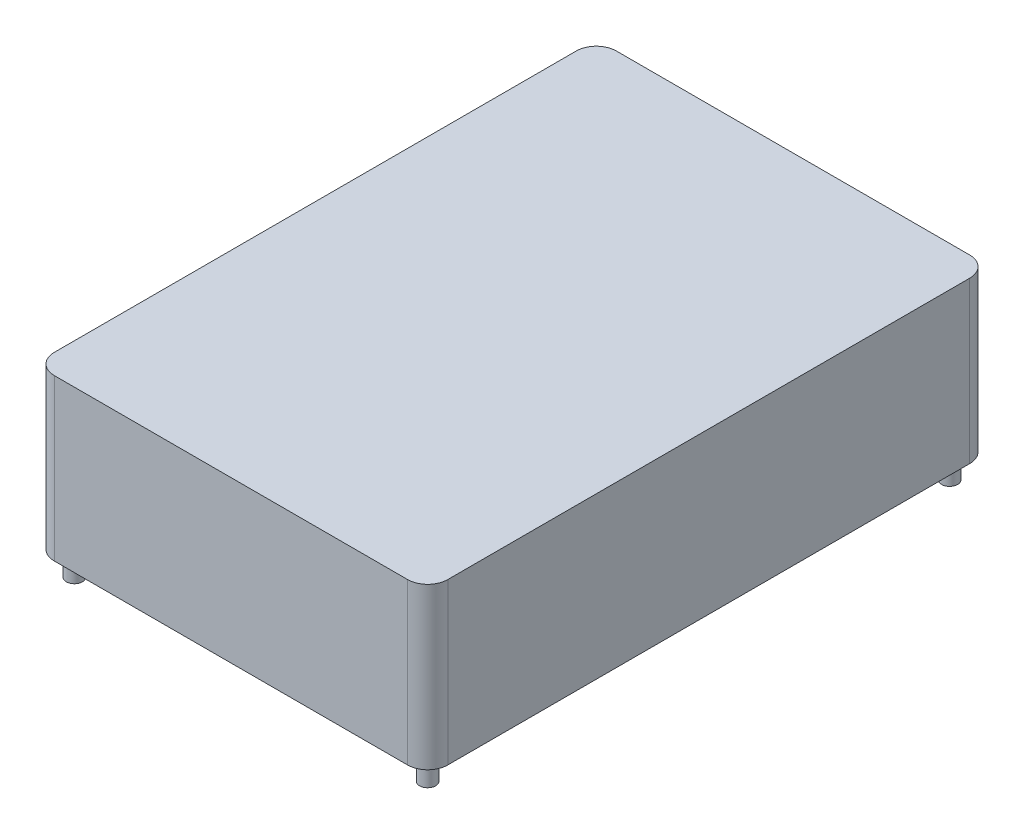
ISO-10303-21;
HEADER;
FILE_DESCRIPTION(('STEP AP214'),'2;1');
FILE_NAME('part.step','',(''),(''),'','','');
FILE_SCHEMA(('AUTOMOTIVE_DESIGN { 1 0 10303 214 1 1 1 1 }'));
ENDSEC;
DATA;
#1=APPLICATION_CONTEXT('core data for automotive mechanical design processes');
#2=APPLICATION_PROTOCOL_DEFINITION('international standard','automotive_design',2000,#1);
#3=PRODUCT_CONTEXT('',#1,'mechanical');
#4=PRODUCT('Part','Part','',(#3));
#5=PRODUCT_RELATED_PRODUCT_CATEGORY('part','',(#4));
#6=PRODUCT_DEFINITION_FORMATION('','',#4);
#7=PRODUCT_DEFINITION_CONTEXT('part definition',#1,'design');
#8=PRODUCT_DEFINITION('design','',#6,#7);
#9=PRODUCT_DEFINITION_SHAPE('','',#8);
#10=(LENGTH_UNIT() NAMED_UNIT(*) SI_UNIT(.MILLI.,.METRE.));
#11=(NAMED_UNIT(*) PLANE_ANGLE_UNIT() SI_UNIT($,.RADIAN.));
#12=(NAMED_UNIT(*) SI_UNIT($,.STERADIAN.) SOLID_ANGLE_UNIT());
#13=UNCERTAINTY_MEASURE_WITH_UNIT(LENGTH_MEASURE(1.E-05),#10,'distance_accuracy_value','');
#14=(GEOMETRIC_REPRESENTATION_CONTEXT(3) GLOBAL_UNCERTAINTY_ASSIGNED_CONTEXT((#13)) GLOBAL_UNIT_ASSIGNED_CONTEXT((#10,
#11,#12)) REPRESENTATION_CONTEXT('',''));
#15=CARTESIAN_POINT('',(0.,0.,0.));
#16=DIRECTION('',(0.,0.,1.));
#17=DIRECTION('',(1.,0.,0.));
#18=AXIS2_PLACEMENT_3D('',#15,#16,#17);
#19=CARTESIAN_POINT('',(62.23,50.8,88.9));
#20=DIRECTION('',(-1.,0.,0.));
#21=DIRECTION('',(0.,0.,1.));
#22=AXIS2_PLACEMENT_3D('',#19,#20,#21);
#23=PLANE('',#22);
#24=DIRECTION('',(0.,0.,-1.));
#25=VECTOR('',#24,1.);
#26=CARTESIAN_POINT('',(62.23,0.,88.9));
#27=LINE('',#26,#25);
#28=CARTESIAN_POINT('',(62.23,0.,82.55));
#29=VERTEX_POINT('',#28);
#30=CARTESIAN_POINT('',(62.23,0.,-82.55));
#31=VERTEX_POINT('',#30);
#32=EDGE_CURVE('E136',#29,#31,#27,.T.);
#33=ORIENTED_EDGE('',*,*,#32,.T.);
#34=DIRECTION('',(0.,-1.,0.));
#35=VECTOR('',#34,1.);
#36=CARTESIAN_POINT('',(62.23,50.8,-82.55));
#37=LINE('',#36,#35);
#38=CARTESIAN_POINT('',(62.23,50.8,-82.55));
#39=VERTEX_POINT('',#38);
#40=EDGE_CURVE('E111',#31,#39,#37,.F.);
#41=ORIENTED_EDGE('',*,*,#40,.T.);
#42=DIRECTION('',(0.,0.,-1.));
#43=VECTOR('',#42,1.);
#44=CARTESIAN_POINT('',(62.23,50.8,88.9));
#45=LINE('',#44,#43);
#46=CARTESIAN_POINT('',(62.23,50.8,82.55));
#47=VERTEX_POINT('',#46);
#48=EDGE_CURVE('E150',#47,#39,#45,.T.);
#49=ORIENTED_EDGE('',*,*,#48,.F.);
#50=DIRECTION('',(0.,-1.,0.));
#51=VECTOR('',#50,1.);
#52=CARTESIAN_POINT('',(62.23,50.8,82.55));
#53=LINE('',#52,#51);
#54=EDGE_CURVE('E117',#47,#29,#53,.T.);
#55=ORIENTED_EDGE('',*,*,#54,.T.);
#56=EDGE_LOOP('',(#33,#41,#49,#55));
#57=FACE_BOUND('',#56,.T.);
#58=ADVANCED_FACE('F38',(#57),#23,.F.);
#59=CARTESIAN_POINT('',(-62.23,50.8,-88.9));
#60=DIRECTION('',(0.,0.,1.));
#61=DIRECTION('',(1.,0.,0.));
#62=AXIS2_PLACEMENT_3D('',#59,#60,#61);
#63=PLANE('',#62);
#64=DIRECTION('',(-1.,0.,0.));
#65=VECTOR('',#64,1.);
#66=CARTESIAN_POINT('',(-62.23,50.8,-88.9));
#67=LINE('',#66,#65);
#68=CARTESIAN_POINT('',(55.88,50.8,-88.9));
#69=VERTEX_POINT('',#68);
#70=CARTESIAN_POINT('',(-55.88,50.8,-88.9));
#71=VERTEX_POINT('',#70);
#72=EDGE_CURVE('E127',#69,#71,#67,.T.);
#73=ORIENTED_EDGE('',*,*,#72,.F.);
#74=DIRECTION('',(0.,-1.,0.));
#75=VECTOR('',#74,1.);
#76=CARTESIAN_POINT('',(55.88,50.8,-88.9));
#77=LINE('',#76,#75);
#78=CARTESIAN_POINT('',(55.88,0.,-88.9));
#79=VERTEX_POINT('',#78);
#80=EDGE_CURVE('E110',#69,#79,#77,.T.);
#81=ORIENTED_EDGE('',*,*,#80,.T.);
#82=DIRECTION('',(-1.,0.,0.));
#83=VECTOR('',#82,1.);
#84=CARTESIAN_POINT('',(-62.23,0.,-88.9));
#85=LINE('',#84,#83);
#86=CARTESIAN_POINT('',(-55.88,0.,-88.9));
#87=VERTEX_POINT('',#86);
#88=EDGE_CURVE('E124',#79,#87,#85,.T.);
#89=ORIENTED_EDGE('',*,*,#88,.T.);
#90=DIRECTION('',(0.,-1.,0.));
#91=VECTOR('',#90,1.);
#92=CARTESIAN_POINT('',(-55.88,50.8,-88.9));
#93=LINE('',#92,#91);
#94=EDGE_CURVE('E130',#87,#71,#93,.F.);
#95=ORIENTED_EDGE('',*,*,#94,.T.);
#96=EDGE_LOOP('',(#73,#81,#89,#95));
#97=FACE_BOUND('',#96,.T.);
#98=ADVANCED_FACE('F123',(#97),#63,.F.);
#99=CARTESIAN_POINT('',(-62.23,50.8,88.9));
#100=DIRECTION('',(1.,0.,0.));
#101=DIRECTION('',(0.,0.,-1.));
#102=AXIS2_PLACEMENT_3D('',#99,#100,#101);
#103=PLANE('',#102);
#104=DIRECTION('',(0.,0.,1.));
#105=VECTOR('',#104,1.);
#106=CARTESIAN_POINT('',(-62.23,0.,88.9));
#107=LINE('',#106,#105);
#108=CARTESIAN_POINT('',(-62.23,0.,-82.55));
#109=VERTEX_POINT('',#108);
#110=CARTESIAN_POINT('',(-62.23,0.,82.55));
#111=VERTEX_POINT('',#110);
#112=EDGE_CURVE('E135',#109,#111,#107,.T.);
#113=ORIENTED_EDGE('',*,*,#112,.T.);
#114=DIRECTION('',(0.,-1.,0.));
#115=VECTOR('',#114,1.);
#116=CARTESIAN_POINT('',(-62.23,50.8,82.55));
#117=LINE('',#116,#115);
#118=CARTESIAN_POINT('',(-62.23,50.8,82.55));
#119=VERTEX_POINT('',#118);
#120=EDGE_CURVE('E187',#111,#119,#117,.F.);
#121=ORIENTED_EDGE('',*,*,#120,.T.);
#122=DIRECTION('',(0.,0.,1.));
#123=VECTOR('',#122,1.);
#124=CARTESIAN_POINT('',(-62.23,50.8,88.9));
#125=LINE('',#124,#123);
#126=CARTESIAN_POINT('',(-62.23,50.8,-82.55));
#127=VERTEX_POINT('',#126);
#128=EDGE_CURVE('E237',#127,#119,#125,.T.);
#129=ORIENTED_EDGE('',*,*,#128,.F.);
#130=DIRECTION('',(0.,-1.,0.));
#131=VECTOR('',#130,1.);
#132=CARTESIAN_POINT('',(-62.23,50.8,-82.55));
#133=LINE('',#132,#131);
#134=EDGE_CURVE('E183',#127,#109,#133,.T.);
#135=ORIENTED_EDGE('',*,*,#134,.T.);
#136=EDGE_LOOP('',(#113,#121,#129,#135));
#137=FACE_BOUND('',#136,.T.);
#138=ADVANCED_FACE('F254',(#137),#103,.F.);
#139=CARTESIAN_POINT('',(-62.23,50.8,88.9));
#140=DIRECTION('',(0.,0.,-1.));
#141=DIRECTION('',(-1.,0.,0.));
#142=AXIS2_PLACEMENT_3D('',#139,#140,#141);
#143=PLANE('',#142);
#144=DIRECTION('',(1.,0.,0.));
#145=VECTOR('',#144,1.);
#146=CARTESIAN_POINT('',(-62.23,0.,88.9));
#147=LINE('',#146,#145);
#148=CARTESIAN_POINT('',(-55.88,0.,88.9));
#149=VERTEX_POINT('',#148);
#150=CARTESIAN_POINT('',(55.88,0.,88.9));
#151=VERTEX_POINT('',#150);
#152=EDGE_CURVE('E142',#149,#151,#147,.T.);
#153=ORIENTED_EDGE('',*,*,#152,.T.);
#154=DIRECTION('',(0.,-1.,0.));
#155=VECTOR('',#154,1.);
#156=CARTESIAN_POINT('',(55.88,50.8,88.9));
#157=LINE('',#156,#155);
#158=CARTESIAN_POINT('',(55.88,50.8,88.9));
#159=VERTEX_POINT('',#158);
#160=EDGE_CURVE('E54',#151,#159,#157,.F.);
#161=ORIENTED_EDGE('',*,*,#160,.T.);
#162=DIRECTION('',(1.,0.,0.));
#163=VECTOR('',#162,1.);
#164=CARTESIAN_POINT('',(-62.23,50.8,88.9));
#165=LINE('',#164,#163);
#166=CARTESIAN_POINT('',(-55.88,50.8,88.9));
#167=VERTEX_POINT('',#166);
#168=EDGE_CURVE('E152',#167,#159,#165,.T.);
#169=ORIENTED_EDGE('',*,*,#168,.F.);
#170=DIRECTION('',(0.,-1.,0.));
#171=VECTOR('',#170,1.);
#172=CARTESIAN_POINT('',(-55.88,50.8,88.9));
#173=LINE('',#172,#171);
#174=EDGE_CURVE('E177',#167,#149,#173,.T.);
#175=ORIENTED_EDGE('',*,*,#174,.T.);
#176=EDGE_LOOP('',(#153,#161,#169,#175));
#177=FACE_BOUND('',#176,.T.);
#178=ADVANCED_FACE('F249',(#177),#143,.F.);
#179=CARTESIAN_POINT('',(0.,50.8,0.));
#180=DIRECTION('',(0.,-1.,0.));
#181=DIRECTION('',(0.,0.,-1.));
#182=AXIS2_PLACEMENT_3D('',#179,#180,#181);
#183=PLANE('',#182);
#184=ORIENTED_EDGE('',*,*,#48,.T.);
#185=CARTESIAN_POINT('',(55.88,50.8,-82.55));
#186=DIRECTION('',(0.,-1.,0.));
#187=DIRECTION('',(0.,0.,-1.));
#188=AXIS2_PLACEMENT_3D('',#185,#186,#187);
#189=CIRCLE('',#188,6.35);
#190=EDGE_CURVE('E174',#39,#69,#189,.F.);
#191=ORIENTED_EDGE('',*,*,#190,.T.);
#192=ORIENTED_EDGE('',*,*,#72,.T.);
#193=CARTESIAN_POINT('',(-55.88,50.8,-82.55));
#194=DIRECTION('',(0.,-1.,0.));
#195=DIRECTION('',(0.,0.,-1.));
#196=AXIS2_PLACEMENT_3D('',#193,#194,#195);
#197=CIRCLE('',#196,6.35);
#198=EDGE_CURVE('E166',#71,#127,#197,.F.);
#199=ORIENTED_EDGE('',*,*,#198,.T.);
#200=ORIENTED_EDGE('',*,*,#128,.T.);
#201=CARTESIAN_POINT('',(-55.88,50.8,82.55));
#202=DIRECTION('',(0.,-1.,0.));
#203=DIRECTION('',(0.,0.,-1.));
#204=AXIS2_PLACEMENT_3D('',#201,#202,#203);
#205=CIRCLE('',#204,6.35);
#206=EDGE_CURVE('E61',#119,#167,#205,.F.);
#207=ORIENTED_EDGE('',*,*,#206,.T.);
#208=ORIENTED_EDGE('',*,*,#168,.T.);
#209=CARTESIAN_POINT('',(55.88,50.8,82.55));
#210=DIRECTION('',(0.,-1.,0.));
#211=DIRECTION('',(0.,0.,-1.));
#212=AXIS2_PLACEMENT_3D('',#209,#210,#211);
#213=CIRCLE('',#212,6.35);
#214=EDGE_CURVE('E171',#159,#47,#213,.F.);
#215=ORIENTED_EDGE('',*,*,#214,.T.);
#216=EDGE_LOOP('',(#184,#191,#192,#199,#200,#207,#208,#215));
#217=FACE_BOUND('',#216,.T.);
#218=ADVANCED_FACE('F207',(#217),#183,.F.);
#219=CARTESIAN_POINT('',(0.,0.,0.));
#220=DIRECTION('',(0.,-1.,0.));
#221=DIRECTION('',(0.,0.,-1.));
#222=AXIS2_PLACEMENT_3D('',#219,#220,#221);
#223=PLANE('',#222);
#224=CARTESIAN_POINT('',(55.88,0.,82.55));
#225=DIRECTION('',(0.,-1.,0.));
#226=DIRECTION('',(0.,0.,-1.));
#227=AXIS2_PLACEMENT_3D('',#224,#225,#226);
#228=CIRCLE('',#227,2.54);
#229=CARTESIAN_POINT('',(55.88,0.,85.09));
#230=VERTEX_POINT('',#229);
#231=EDGE_CURVE('E11',#230,#230,#228,.T.);
#232=ORIENTED_EDGE('',*,*,#231,.F.);
#233=EDGE_LOOP('',(#232));
#234=FACE_BOUND('',#233,.T.);
#235=CARTESIAN_POINT('',(-55.88,0.,82.55));
#236=DIRECTION('',(0.,-1.,0.));
#237=DIRECTION('',(0.,0.,-1.));
#238=AXIS2_PLACEMENT_3D('',#235,#236,#237);
#239=CIRCLE('',#238,2.54);
#240=CARTESIAN_POINT('',(-55.88,0.,85.09));
#241=VERTEX_POINT('',#240);
#242=EDGE_CURVE('E47',#241,#241,#239,.T.);
#243=ORIENTED_EDGE('',*,*,#242,.F.);
#244=EDGE_LOOP('',(#243));
#245=FACE_BOUND('',#244,.T.);
#246=CARTESIAN_POINT('',(55.88,0.,-82.55));
#247=DIRECTION('',(0.,-1.,0.));
#248=DIRECTION('',(0.,0.,-1.));
#249=AXIS2_PLACEMENT_3D('',#246,#247,#248);
#250=CIRCLE('',#249,2.54);
#251=CARTESIAN_POINT('',(55.88,0.,-80.01));
#252=VERTEX_POINT('',#251);
#253=EDGE_CURVE('E194',#252,#252,#250,.T.);
#254=ORIENTED_EDGE('',*,*,#253,.F.);
#255=EDGE_LOOP('',(#254));
#256=FACE_BOUND('',#255,.T.);
#257=CARTESIAN_POINT('',(-55.88,0.,-82.55));
#258=DIRECTION('',(0.,-1.,0.));
#259=DIRECTION('',(0.,0.,-1.));
#260=AXIS2_PLACEMENT_3D('',#257,#258,#259);
#261=CIRCLE('',#260,2.54);
#262=CARTESIAN_POINT('',(-55.88,0.,-80.01));
#263=VERTEX_POINT('',#262);
#264=EDGE_CURVE('E190',#263,#263,#261,.T.);
#265=ORIENTED_EDGE('',*,*,#264,.F.);
#266=EDGE_LOOP('',(#265));
#267=FACE_BOUND('',#266,.T.);
#268=ORIENTED_EDGE('',*,*,#88,.F.);
#269=CARTESIAN_POINT('',(55.88,0.,-82.55));
#270=DIRECTION('',(0.,-1.,0.));
#271=DIRECTION('',(0.,0.,-1.));
#272=AXIS2_PLACEMENT_3D('',#269,#270,#271);
#273=CIRCLE('',#272,6.35);
#274=EDGE_CURVE('E106',#79,#31,#273,.T.);
#275=ORIENTED_EDGE('',*,*,#274,.T.);
#276=ORIENTED_EDGE('',*,*,#32,.F.);
#277=CARTESIAN_POINT('',(55.88,0.,82.55));
#278=DIRECTION('',(0.,-1.,0.));
#279=DIRECTION('',(0.,0.,-1.));
#280=AXIS2_PLACEMENT_3D('',#277,#278,#279);
#281=CIRCLE('',#280,6.35);
#282=EDGE_CURVE('E118',#29,#151,#281,.T.);
#283=ORIENTED_EDGE('',*,*,#282,.T.);
#284=ORIENTED_EDGE('',*,*,#152,.F.);
#285=CARTESIAN_POINT('',(-55.88,0.,82.55));
#286=DIRECTION('',(0.,-1.,0.));
#287=DIRECTION('',(0.,0.,-1.));
#288=AXIS2_PLACEMENT_3D('',#285,#286,#287);
#289=CIRCLE('',#288,6.35);
#290=EDGE_CURVE('E156',#149,#111,#289,.T.);
#291=ORIENTED_EDGE('',*,*,#290,.T.);
#292=ORIENTED_EDGE('',*,*,#112,.F.);
#293=CARTESIAN_POINT('',(-55.88,0.,-82.55));
#294=DIRECTION('',(0.,-1.,0.));
#295=DIRECTION('',(0.,0.,-1.));
#296=AXIS2_PLACEMENT_3D('',#293,#294,#295);
#297=CIRCLE('',#296,6.35);
#298=EDGE_CURVE('E129',#109,#87,#297,.T.);
#299=ORIENTED_EDGE('',*,*,#298,.T.);
#300=EDGE_LOOP('',(#268,#275,#276,#283,#284,#291,#292,#299));
#301=FACE_BOUND('',#300,.T.);
#302=ADVANCED_FACE('F132',(#234,#245,#256,#267,#301),#223,.T.);
#303=CARTESIAN_POINT('',(55.88,50.8,-82.55));
#304=DIRECTION('',(0.,-1.,0.));
#305=DIRECTION('',(0.,0.,-1.));
#306=AXIS2_PLACEMENT_3D('',#303,#304,#305);
#307=CYLINDRICAL_SURFACE('',#306,6.35);
#308=ORIENTED_EDGE('',*,*,#190,.F.);
#309=ORIENTED_EDGE('',*,*,#40,.F.);
#310=ORIENTED_EDGE('',*,*,#274,.F.);
#311=ORIENTED_EDGE('',*,*,#80,.F.);
#312=EDGE_LOOP('',(#308,#309,#310,#311));
#313=FACE_BOUND('',#312,.T.);
#314=ADVANCED_FACE('F109',(#313),#307,.T.);
#315=CARTESIAN_POINT('',(55.88,50.8,82.55));
#316=DIRECTION('',(0.,-1.,0.));
#317=DIRECTION('',(0.,0.,-1.));
#318=AXIS2_PLACEMENT_3D('',#315,#316,#317);
#319=CYLINDRICAL_SURFACE('',#318,6.35);
#320=ORIENTED_EDGE('',*,*,#214,.F.);
#321=ORIENTED_EDGE('',*,*,#160,.F.);
#322=ORIENTED_EDGE('',*,*,#282,.F.);
#323=ORIENTED_EDGE('',*,*,#54,.F.);
#324=EDGE_LOOP('',(#320,#321,#322,#323));
#325=FACE_BOUND('',#324,.T.);
#326=ADVANCED_FACE('F246',(#325),#319,.T.);
#327=CARTESIAN_POINT('',(-55.88,50.8,82.55));
#328=DIRECTION('',(0.,-1.,0.));
#329=DIRECTION('',(0.,0.,-1.));
#330=AXIS2_PLACEMENT_3D('',#327,#328,#329);
#331=CYLINDRICAL_SURFACE('',#330,6.35);
#332=ORIENTED_EDGE('',*,*,#206,.F.);
#333=ORIENTED_EDGE('',*,*,#120,.F.);
#334=ORIENTED_EDGE('',*,*,#290,.F.);
#335=ORIENTED_EDGE('',*,*,#174,.F.);
#336=EDGE_LOOP('',(#332,#333,#334,#335));
#337=FACE_BOUND('',#336,.T.);
#338=ADVANCED_FACE('F251',(#337),#331,.T.);
#339=CARTESIAN_POINT('',(-55.88,50.8,-82.55));
#340=DIRECTION('',(0.,-1.,0.));
#341=DIRECTION('',(0.,0.,-1.));
#342=AXIS2_PLACEMENT_3D('',#339,#340,#341);
#343=CYLINDRICAL_SURFACE('',#342,6.35);
#344=ORIENTED_EDGE('',*,*,#198,.F.);
#345=ORIENTED_EDGE('',*,*,#94,.F.);
#346=ORIENTED_EDGE('',*,*,#298,.F.);
#347=ORIENTED_EDGE('',*,*,#134,.F.);
#348=EDGE_LOOP('',(#344,#345,#346,#347));
#349=FACE_BOUND('',#348,.T.);
#350=ADVANCED_FACE('F40',(#349),#343,.T.);
#351=CARTESIAN_POINT('',(-55.88,-7.61999999999999,-82.55));
#352=DIRECTION('',(0.,1.,0.));
#353=DIRECTION('',(0.,0.,1.));
#354=AXIS2_PLACEMENT_3D('',#351,#352,#353);
#355=CYLINDRICAL_SURFACE('',#354,2.54);
#356=CARTESIAN_POINT('',(-55.88,-7.61999999999999,-82.55));
#357=DIRECTION('',(0.,1.,0.));
#358=DIRECTION('',(0.,0.,1.));
#359=AXIS2_PLACEMENT_3D('',#356,#357,#358);
#360=CIRCLE('',#359,2.54);
#361=CARTESIAN_POINT('',(-55.88,-7.62,-80.01));
#362=VERTEX_POINT('',#361);
#363=EDGE_CURVE('E144',#362,#362,#360,.T.);
#364=CARTESIAN_POINT('',(-55.88,0.,-80.01));
#365=CARTESIAN_POINT('',(-55.88,-0.0793749999999989,-80.01));
#366=CARTESIAN_POINT('',(-55.88,-0.158749999999999,-80.01));
#367=CARTESIAN_POINT('',(-55.88,-0.317499999999999,-80.01));
#368=CARTESIAN_POINT('',(-55.88,-0.396874999999999,-80.01));
#369=CARTESIAN_POINT('',(-55.88,-0.555624999999999,-80.01));
#370=CARTESIAN_POINT('',(-55.88,-0.634999999999999,-80.01));
#371=CARTESIAN_POINT('',(-55.88,-0.793749999999999,-80.01));
#372=CARTESIAN_POINT('',(-55.88,-0.873124999999999,-80.01));
#373=CARTESIAN_POINT('',(-55.88,-1.031875,-80.01));
#374=CARTESIAN_POINT('',(-55.88,-1.11125,-80.01));
#375=CARTESIAN_POINT('',(-55.88,-1.27,-80.01));
#376=CARTESIAN_POINT('',(-55.88,-1.349375,-80.01));
#377=CARTESIAN_POINT('',(-55.88,-1.508125,-80.01));
#378=CARTESIAN_POINT('',(-55.88,-1.5875,-80.01));
#379=CARTESIAN_POINT('',(-55.88,-1.74625,-80.01));
#380=CARTESIAN_POINT('',(-55.88,-1.825625,-80.01));
#381=CARTESIAN_POINT('',(-55.88,-1.984375,-80.01));
#382=CARTESIAN_POINT('',(-55.88,-2.06375,-80.01));
#383=CARTESIAN_POINT('',(-55.88,-2.2225,-80.01));
#384=CARTESIAN_POINT('',(-55.88,-2.301875,-80.01));
#385=CARTESIAN_POINT('',(-55.88,-2.460625,-80.01));
#386=CARTESIAN_POINT('',(-55.88,-2.54,-80.01));
#387=CARTESIAN_POINT('',(-55.88,-2.69875,-80.01));
#388=CARTESIAN_POINT('',(-55.88,-2.778125,-80.01));
#389=CARTESIAN_POINT('',(-55.88,-2.936875,-80.01));
#390=CARTESIAN_POINT('',(-55.88,-3.01625,-80.01));
#391=CARTESIAN_POINT('',(-55.88,-3.175,-80.01));
#392=CARTESIAN_POINT('',(-55.88,-3.254375,-80.01));
#393=CARTESIAN_POINT('',(-55.88,-3.413125,-80.01));
#394=CARTESIAN_POINT('',(-55.88,-3.4925,-80.01));
#395=CARTESIAN_POINT('',(-55.88,-3.65125,-80.01));
#396=CARTESIAN_POINT('',(-55.88,-3.730625,-80.01));
#397=CARTESIAN_POINT('',(-55.88,-3.889375,-80.01));
#398=CARTESIAN_POINT('',(-55.88,-3.96875,-80.01));
#399=CARTESIAN_POINT('',(-55.88,-4.1275,-80.01));
#400=CARTESIAN_POINT('',(-55.88,-4.206875,-80.01));
#401=CARTESIAN_POINT('',(-55.88,-4.365625,-80.01));
#402=CARTESIAN_POINT('',(-55.88,-4.445,-80.01));
#403=CARTESIAN_POINT('',(-55.88,-4.60375,-80.01));
#404=CARTESIAN_POINT('',(-55.88,-4.683125,-80.01));
#405=CARTESIAN_POINT('',(-55.88,-4.841875,-80.01));
#406=CARTESIAN_POINT('',(-55.88,-4.92125,-80.01));
#407=CARTESIAN_POINT('',(-55.88,-5.08,-80.01));
#408=CARTESIAN_POINT('',(-55.88,-5.159375,-80.01));
#409=CARTESIAN_POINT('',(-55.88,-5.318125,-80.01));
#410=CARTESIAN_POINT('',(-55.88,-5.3975,-80.01));
#411=CARTESIAN_POINT('',(-55.88,-5.55625,-80.01));
#412=CARTESIAN_POINT('',(-55.88,-5.635625,-80.01));
#413=CARTESIAN_POINT('',(-55.88,-5.794375,-80.01));
#414=CARTESIAN_POINT('',(-55.88,-5.87375,-80.01));
#415=CARTESIAN_POINT('',(-55.88,-6.0325,-80.01));
#416=CARTESIAN_POINT('',(-55.88,-6.111875,-80.01));
#417=CARTESIAN_POINT('',(-55.88,-6.270625,-80.01));
#418=CARTESIAN_POINT('',(-55.88,-6.35,-80.01));
#419=CARTESIAN_POINT('',(-55.88,-6.50875,-80.01));
#420=CARTESIAN_POINT('',(-55.88,-6.588125,-80.01));
#421=CARTESIAN_POINT('',(-55.88,-6.746875,-80.01));
#422=CARTESIAN_POINT('',(-55.88,-6.82625,-80.01));
#423=CARTESIAN_POINT('',(-55.88,-6.985,-80.01));
#424=CARTESIAN_POINT('',(-55.88,-7.064375,-80.01));
#425=CARTESIAN_POINT('',(-55.88,-7.223125,-80.01));
#426=CARTESIAN_POINT('',(-55.88,-7.3025,-80.01));
#427=CARTESIAN_POINT('',(-55.88,-7.46125,-80.01));
#428=CARTESIAN_POINT('',(-55.88,-7.540625,-80.01));
#429=CARTESIAN_POINT('',(-55.88,-7.62,-80.01));
#430=B_SPLINE_CURVE_WITH_KNOTS('',3,(#364,#365,#366,#367,#368,#369,#370,#371,#372,#373,#374,
#375,#376,#377,#378,#379,#380,#381,#382,#383,#384,#385,#386,#387,#388,#389,#390,#391,#392,#393,
#394,#395,#396,#397,#398,#399,#400,#401,#402,#403,#404,#405,#406,#407,#408,#409,#410,#411,#412,
#413,#414,#415,#416,#417,#418,#419,#420,#421,#422,#423,#424,#425,#426,#427,#428,#429),
.UNSPECIFIED.,.F.,.F.,(4,2,2,2,2,2,2,2,2,2,2,2,2,2,2,2,2,2,2,2,2,2,2,2,2,2,2,2,2,2,2,2,4),(0.,
0.238125,0.47625,0.714375,0.952499999999999,1.190625,1.42875,1.666875,1.905,2.143125,2.38125,
2.619375,2.8575,3.095625,3.33375,3.571875,3.81,4.048125,4.28625,4.524375,4.7625,5.000625,
5.23875,5.476875,5.715,5.953125,6.19125,6.429375,6.6675,6.905625,7.14375,7.381875,7.62),.UNSPECIFIED.);
#431=EDGE_CURVE('BSEAM214',#263,#362,#430,.T.);
#432=ORIENTED_EDGE('',*,*,#264,.T.);
#433=ORIENTED_EDGE('',*,*,#363,.T.);
#434=ORIENTED_EDGE('',*,*,#431,.T.);
#435=ORIENTED_EDGE('',*,*,#431,.F.);
#436=EDGE_LOOP('',(#432,#434,#433,#435));
#437=FACE_BOUND('',#436,.T.);
#438=ADVANCED_FACE('F214',(#437),#355,.T.);
#439=CARTESIAN_POINT('',(-55.88,-7.61999999999999,-82.55));
#440=DIRECTION('',(0.,1.,0.));
#441=DIRECTION('',(0.,0.,1.));
#442=AXIS2_PLACEMENT_3D('',#439,#440,#441);
#443=PLANE('',#442);
#444=ORIENTED_EDGE('',*,*,#363,.F.);
#445=EDGE_LOOP('',(#444));
#446=FACE_BOUND('',#445,.T.);
#447=ADVANCED_FACE('F217',(#446),#443,.F.);
#448=CARTESIAN_POINT('',(55.88,-7.61999999999999,-82.55));
#449=DIRECTION('',(0.,1.,0.));
#450=DIRECTION('',(0.,0.,1.));
#451=AXIS2_PLACEMENT_3D('',#448,#449,#450);
#452=CYLINDRICAL_SURFACE('',#451,2.54);
#453=CARTESIAN_POINT('',(55.88,-7.61999999999999,-82.55));
#454=DIRECTION('',(0.,1.,0.));
#455=DIRECTION('',(0.,0.,1.));
#456=AXIS2_PLACEMENT_3D('',#453,#454,#455);
#457=CIRCLE('',#456,2.54);
#458=CARTESIAN_POINT('',(55.88,-7.62,-80.01));
#459=VERTEX_POINT('',#458);
#460=EDGE_CURVE('E223',#459,#459,#457,.T.);
#461=CARTESIAN_POINT('',(55.88,0.,-80.01));
#462=CARTESIAN_POINT('',(55.88,-0.0793749999999989,-80.01));
#463=CARTESIAN_POINT('',(55.88,-0.158749999999999,-80.01));
#464=CARTESIAN_POINT('',(55.88,-0.317499999999999,-80.01));
#465=CARTESIAN_POINT('',(55.88,-0.396874999999999,-80.01));
#466=CARTESIAN_POINT('',(55.88,-0.555624999999999,-80.01));
#467=CARTESIAN_POINT('',(55.88,-0.634999999999999,-80.01));
#468=CARTESIAN_POINT('',(55.88,-0.793749999999999,-80.01));
#469=CARTESIAN_POINT('',(55.88,-0.873124999999999,-80.01));
#470=CARTESIAN_POINT('',(55.88,-1.031875,-80.01));
#471=CARTESIAN_POINT('',(55.88,-1.11125,-80.01));
#472=CARTESIAN_POINT('',(55.88,-1.27,-80.01));
#473=CARTESIAN_POINT('',(55.88,-1.349375,-80.01));
#474=CARTESIAN_POINT('',(55.88,-1.508125,-80.01));
#475=CARTESIAN_POINT('',(55.88,-1.5875,-80.01));
#476=CARTESIAN_POINT('',(55.88,-1.74625,-80.01));
#477=CARTESIAN_POINT('',(55.88,-1.825625,-80.01));
#478=CARTESIAN_POINT('',(55.88,-1.984375,-80.01));
#479=CARTESIAN_POINT('',(55.88,-2.06375,-80.01));
#480=CARTESIAN_POINT('',(55.88,-2.2225,-80.01));
#481=CARTESIAN_POINT('',(55.88,-2.301875,-80.01));
#482=CARTESIAN_POINT('',(55.88,-2.460625,-80.01));
#483=CARTESIAN_POINT('',(55.88,-2.54,-80.01));
#484=CARTESIAN_POINT('',(55.88,-2.69875,-80.01));
#485=CARTESIAN_POINT('',(55.88,-2.778125,-80.01));
#486=CARTESIAN_POINT('',(55.88,-2.936875,-80.01));
#487=CARTESIAN_POINT('',(55.88,-3.01625,-80.01));
#488=CARTESIAN_POINT('',(55.88,-3.175,-80.01));
#489=CARTESIAN_POINT('',(55.88,-3.254375,-80.01));
#490=CARTESIAN_POINT('',(55.88,-3.413125,-80.01));
#491=CARTESIAN_POINT('',(55.88,-3.4925,-80.01));
#492=CARTESIAN_POINT('',(55.88,-3.65125,-80.01));
#493=CARTESIAN_POINT('',(55.88,-3.730625,-80.01));
#494=CARTESIAN_POINT('',(55.88,-3.889375,-80.01));
#495=CARTESIAN_POINT('',(55.88,-3.96875,-80.01));
#496=CARTESIAN_POINT('',(55.88,-4.1275,-80.01));
#497=CARTESIAN_POINT('',(55.88,-4.206875,-80.01));
#498=CARTESIAN_POINT('',(55.88,-4.365625,-80.01));
#499=CARTESIAN_POINT('',(55.88,-4.445,-80.01));
#500=CARTESIAN_POINT('',(55.88,-4.60375,-80.01));
#501=CARTESIAN_POINT('',(55.88,-4.683125,-80.01));
#502=CARTESIAN_POINT('',(55.88,-4.841875,-80.01));
#503=CARTESIAN_POINT('',(55.88,-4.92125,-80.01));
#504=CARTESIAN_POINT('',(55.88,-5.08,-80.01));
#505=CARTESIAN_POINT('',(55.88,-5.159375,-80.01));
#506=CARTESIAN_POINT('',(55.88,-5.318125,-80.01));
#507=CARTESIAN_POINT('',(55.88,-5.3975,-80.01));
#508=CARTESIAN_POINT('',(55.88,-5.55625,-80.01));
#509=CARTESIAN_POINT('',(55.88,-5.635625,-80.01));
#510=CARTESIAN_POINT('',(55.88,-5.794375,-80.01));
#511=CARTESIAN_POINT('',(55.88,-5.87375,-80.01));
#512=CARTESIAN_POINT('',(55.88,-6.0325,-80.01));
#513=CARTESIAN_POINT('',(55.88,-6.111875,-80.01));
#514=CARTESIAN_POINT('',(55.88,-6.270625,-80.01));
#515=CARTESIAN_POINT('',(55.88,-6.35,-80.01));
#516=CARTESIAN_POINT('',(55.88,-6.50875,-80.01));
#517=CARTESIAN_POINT('',(55.88,-6.588125,-80.01));
#518=CARTESIAN_POINT('',(55.88,-6.746875,-80.01));
#519=CARTESIAN_POINT('',(55.88,-6.82625,-80.01));
#520=CARTESIAN_POINT('',(55.88,-6.985,-80.01));
#521=CARTESIAN_POINT('',(55.88,-7.064375,-80.01));
#522=CARTESIAN_POINT('',(55.88,-7.223125,-80.01));
#523=CARTESIAN_POINT('',(55.88,-7.3025,-80.01));
#524=CARTESIAN_POINT('',(55.88,-7.46125,-80.01));
#525=CARTESIAN_POINT('',(55.88,-7.540625,-80.01));
#526=CARTESIAN_POINT('',(55.88,-7.62,-80.01));
#527=B_SPLINE_CURVE_WITH_KNOTS('',3,(#461,#462,#463,#464,#465,#466,#467,#468,#469,#470,#471,
#472,#473,#474,#475,#476,#477,#478,#479,#480,#481,#482,#483,#484,#485,#486,#487,#488,#489,#490,
#491,#492,#493,#494,#495,#496,#497,#498,#499,#500,#501,#502,#503,#504,#505,#506,#507,#508,#509,
#510,#511,#512,#513,#514,#515,#516,#517,#518,#519,#520,#521,#522,#523,#524,#525,#526),
.UNSPECIFIED.,.F.,.F.,(4,2,2,2,2,2,2,2,2,2,2,2,2,2,2,2,2,2,2,2,2,2,2,2,2,2,2,2,2,2,2,2,4),(0.,
0.238125,0.47625,0.714375,0.952499999999999,1.190625,1.42875,1.666875,1.905,2.143125,2.38125,
2.619375,2.8575,3.095625,3.33375,3.571875,3.81,4.048125,4.28625,4.524375,4.7625,5.000625,
5.23875,5.476875,5.715,5.953125,6.19125,6.429375,6.6675,6.905625,7.14375,7.381875,7.62),.UNSPECIFIED.);
#528=EDGE_CURVE('BSEAM303',#252,#459,#527,.T.);
#529=ORIENTED_EDGE('',*,*,#253,.T.);
#530=ORIENTED_EDGE('',*,*,#460,.T.);
#531=ORIENTED_EDGE('',*,*,#528,.T.);
#532=ORIENTED_EDGE('',*,*,#528,.F.);
#533=EDGE_LOOP('',(#529,#531,#530,#532));
#534=FACE_BOUND('',#533,.T.);
#535=ADVANCED_FACE('F303',(#534),#452,.T.);
#536=CARTESIAN_POINT('',(55.88,-7.61999999999999,-82.55));
#537=DIRECTION('',(0.,1.,0.));
#538=DIRECTION('',(0.,0.,1.));
#539=AXIS2_PLACEMENT_3D('',#536,#537,#538);
#540=PLANE('',#539);
#541=ORIENTED_EDGE('',*,*,#460,.F.);
#542=EDGE_LOOP('',(#541));
#543=FACE_BOUND('',#542,.T.);
#544=ADVANCED_FACE('F312',(#543),#540,.F.);
#545=CARTESIAN_POINT('',(-55.88,-7.61999999999999,82.55));
#546=DIRECTION('',(0.,1.,0.));
#547=DIRECTION('',(0.,0.,1.));
#548=AXIS2_PLACEMENT_3D('',#545,#546,#547);
#549=CYLINDRICAL_SURFACE('',#548,2.54);
#550=CARTESIAN_POINT('',(-55.88,-7.61999999999999,82.55));
#551=DIRECTION('',(0.,1.,0.));
#552=DIRECTION('',(0.,0.,1.));
#553=AXIS2_PLACEMENT_3D('',#550,#551,#552);
#554=CIRCLE('',#553,2.54);
#555=CARTESIAN_POINT('',(-55.88,-7.62,85.09));
#556=VERTEX_POINT('',#555);
#557=EDGE_CURVE('E228',#556,#556,#554,.T.);
#558=CARTESIAN_POINT('',(-55.88,0.,85.09));
#559=CARTESIAN_POINT('',(-55.88,-0.0793749999999989,85.09));
#560=CARTESIAN_POINT('',(-55.88,-0.158749999999999,85.09));
#561=CARTESIAN_POINT('',(-55.88,-0.317499999999999,85.09));
#562=CARTESIAN_POINT('',(-55.88,-0.396874999999999,85.09));
#563=CARTESIAN_POINT('',(-55.88,-0.555624999999999,85.09));
#564=CARTESIAN_POINT('',(-55.88,-0.634999999999999,85.09));
#565=CARTESIAN_POINT('',(-55.88,-0.793749999999999,85.09));
#566=CARTESIAN_POINT('',(-55.88,-0.873124999999999,85.09));
#567=CARTESIAN_POINT('',(-55.88,-1.031875,85.09));
#568=CARTESIAN_POINT('',(-55.88,-1.11125,85.09));
#569=CARTESIAN_POINT('',(-55.88,-1.27,85.09));
#570=CARTESIAN_POINT('',(-55.88,-1.349375,85.09));
#571=CARTESIAN_POINT('',(-55.88,-1.508125,85.09));
#572=CARTESIAN_POINT('',(-55.88,-1.5875,85.09));
#573=CARTESIAN_POINT('',(-55.88,-1.74625,85.09));
#574=CARTESIAN_POINT('',(-55.88,-1.825625,85.09));
#575=CARTESIAN_POINT('',(-55.88,-1.984375,85.09));
#576=CARTESIAN_POINT('',(-55.88,-2.06375,85.09));
#577=CARTESIAN_POINT('',(-55.88,-2.2225,85.09));
#578=CARTESIAN_POINT('',(-55.88,-2.301875,85.09));
#579=CARTESIAN_POINT('',(-55.88,-2.460625,85.09));
#580=CARTESIAN_POINT('',(-55.88,-2.54,85.09));
#581=CARTESIAN_POINT('',(-55.88,-2.69875,85.09));
#582=CARTESIAN_POINT('',(-55.88,-2.778125,85.09));
#583=CARTESIAN_POINT('',(-55.88,-2.936875,85.09));
#584=CARTESIAN_POINT('',(-55.88,-3.01625,85.09));
#585=CARTESIAN_POINT('',(-55.88,-3.175,85.09));
#586=CARTESIAN_POINT('',(-55.88,-3.254375,85.09));
#587=CARTESIAN_POINT('',(-55.88,-3.413125,85.09));
#588=CARTESIAN_POINT('',(-55.88,-3.4925,85.09));
#589=CARTESIAN_POINT('',(-55.88,-3.65125,85.09));
#590=CARTESIAN_POINT('',(-55.88,-3.730625,85.09));
#591=CARTESIAN_POINT('',(-55.88,-3.889375,85.09));
#592=CARTESIAN_POINT('',(-55.88,-3.96875,85.09));
#593=CARTESIAN_POINT('',(-55.88,-4.1275,85.09));
#594=CARTESIAN_POINT('',(-55.88,-4.206875,85.09));
#595=CARTESIAN_POINT('',(-55.88,-4.365625,85.09));
#596=CARTESIAN_POINT('',(-55.88,-4.445,85.09));
#597=CARTESIAN_POINT('',(-55.88,-4.60375,85.09));
#598=CARTESIAN_POINT('',(-55.88,-4.683125,85.09));
#599=CARTESIAN_POINT('',(-55.88,-4.841875,85.09));
#600=CARTESIAN_POINT('',(-55.88,-4.92125,85.09));
#601=CARTESIAN_POINT('',(-55.88,-5.08,85.09));
#602=CARTESIAN_POINT('',(-55.88,-5.159375,85.09));
#603=CARTESIAN_POINT('',(-55.88,-5.318125,85.09));
#604=CARTESIAN_POINT('',(-55.88,-5.3975,85.09));
#605=CARTESIAN_POINT('',(-55.88,-5.55625,85.09));
#606=CARTESIAN_POINT('',(-55.88,-5.635625,85.09));
#607=CARTESIAN_POINT('',(-55.88,-5.794375,85.09));
#608=CARTESIAN_POINT('',(-55.88,-5.87375,85.09));
#609=CARTESIAN_POINT('',(-55.88,-6.0325,85.09));
#610=CARTESIAN_POINT('',(-55.88,-6.111875,85.09));
#611=CARTESIAN_POINT('',(-55.88,-6.270625,85.09));
#612=CARTESIAN_POINT('',(-55.88,-6.35,85.09));
#613=CARTESIAN_POINT('',(-55.88,-6.50875,85.09));
#614=CARTESIAN_POINT('',(-55.88,-6.588125,85.09));
#615=CARTESIAN_POINT('',(-55.88,-6.746875,85.09));
#616=CARTESIAN_POINT('',(-55.88,-6.82625,85.09));
#617=CARTESIAN_POINT('',(-55.88,-6.985,85.09));
#618=CARTESIAN_POINT('',(-55.88,-7.064375,85.09));
#619=CARTESIAN_POINT('',(-55.88,-7.223125,85.09));
#620=CARTESIAN_POINT('',(-55.88,-7.3025,85.09));
#621=CARTESIAN_POINT('',(-55.88,-7.46125,85.09));
#622=CARTESIAN_POINT('',(-55.88,-7.540625,85.09));
#623=CARTESIAN_POINT('',(-55.88,-7.62,85.09));
#624=B_SPLINE_CURVE_WITH_KNOTS('',3,(#558,#559,#560,#561,#562,#563,#564,#565,#566,#567,#568,
#569,#570,#571,#572,#573,#574,#575,#576,#577,#578,#579,#580,#581,#582,#583,#584,#585,#586,#587,
#588,#589,#590,#591,#592,#593,#594,#595,#596,#597,#598,#599,#600,#601,#602,#603,#604,#605,#606,
#607,#608,#609,#610,#611,#612,#613,#614,#615,#616,#617,#618,#619,#620,#621,#622,#623),
.UNSPECIFIED.,.F.,.F.,(4,2,2,2,2,2,2,2,2,2,2,2,2,2,2,2,2,2,2,2,2,2,2,2,2,2,2,2,2,2,2,2,4),(0.,
0.238125,0.47625,0.714375,0.952499999999999,1.190625,1.42875,1.666875,1.905,2.143125,2.38125,
2.619375,2.8575,3.095625,3.33375,3.571875,3.81,4.048125,4.28625,4.524375,4.7625,5.000625,
5.23875,5.476875,5.715,5.953125,6.19125,6.429375,6.6675,6.905625,7.14375,7.381875,7.62),.UNSPECIFIED.);
#625=EDGE_CURVE('BSEAM202',#241,#556,#624,.T.);
#626=ORIENTED_EDGE('',*,*,#242,.T.);
#627=ORIENTED_EDGE('',*,*,#557,.T.);
#628=ORIENTED_EDGE('',*,*,#625,.T.);
#629=ORIENTED_EDGE('',*,*,#625,.F.);
#630=EDGE_LOOP('',(#626,#628,#627,#629));
#631=FACE_BOUND('',#630,.T.);
#632=ADVANCED_FACE('F202',(#631),#549,.T.);
#633=CARTESIAN_POINT('',(-55.88,-7.61999999999999,82.55));
#634=DIRECTION('',(0.,1.,0.));
#635=DIRECTION('',(0.,0.,1.));
#636=AXIS2_PLACEMENT_3D('',#633,#634,#635);
#637=PLANE('',#636);
#638=ORIENTED_EDGE('',*,*,#557,.F.);
#639=EDGE_LOOP('',(#638));
#640=FACE_BOUND('',#639,.T.);
#641=ADVANCED_FACE('F331',(#640),#637,.F.);
#642=CARTESIAN_POINT('',(55.88,-7.61999999999999,82.55));
#643=DIRECTION('',(0.,1.,0.));
#644=DIRECTION('',(0.,0.,1.));
#645=AXIS2_PLACEMENT_3D('',#642,#643,#644);
#646=CYLINDRICAL_SURFACE('',#645,2.54);
#647=CARTESIAN_POINT('',(55.88,-7.61999999999999,82.55));
#648=DIRECTION('',(0.,1.,0.));
#649=DIRECTION('',(0.,0.,1.));
#650=AXIS2_PLACEMENT_3D('',#647,#648,#649);
#651=CIRCLE('',#650,2.54);
#652=CARTESIAN_POINT('',(55.88,-7.62,85.09));
#653=VERTEX_POINT('',#652);
#654=EDGE_CURVE('E445',#653,#653,#651,.T.);
#655=CARTESIAN_POINT('',(55.88,0.,85.09));
#656=CARTESIAN_POINT('',(55.88,-0.0793749999999989,85.09));
#657=CARTESIAN_POINT('',(55.88,-0.158749999999999,85.09));
#658=CARTESIAN_POINT('',(55.88,-0.317499999999999,85.09));
#659=CARTESIAN_POINT('',(55.88,-0.396874999999999,85.09));
#660=CARTESIAN_POINT('',(55.88,-0.555624999999999,85.09));
#661=CARTESIAN_POINT('',(55.88,-0.634999999999999,85.09));
#662=CARTESIAN_POINT('',(55.88,-0.793749999999999,85.09));
#663=CARTESIAN_POINT('',(55.88,-0.873124999999999,85.09));
#664=CARTESIAN_POINT('',(55.88,-1.031875,85.09));
#665=CARTESIAN_POINT('',(55.88,-1.11125,85.09));
#666=CARTESIAN_POINT('',(55.88,-1.27,85.09));
#667=CARTESIAN_POINT('',(55.88,-1.349375,85.09));
#668=CARTESIAN_POINT('',(55.88,-1.508125,85.09));
#669=CARTESIAN_POINT('',(55.88,-1.5875,85.09));
#670=CARTESIAN_POINT('',(55.88,-1.74625,85.09));
#671=CARTESIAN_POINT('',(55.88,-1.825625,85.09));
#672=CARTESIAN_POINT('',(55.88,-1.984375,85.09));
#673=CARTESIAN_POINT('',(55.88,-2.06375,85.09));
#674=CARTESIAN_POINT('',(55.88,-2.2225,85.09));
#675=CARTESIAN_POINT('',(55.88,-2.301875,85.09));
#676=CARTESIAN_POINT('',(55.88,-2.460625,85.09));
#677=CARTESIAN_POINT('',(55.88,-2.54,85.09));
#678=CARTESIAN_POINT('',(55.88,-2.69875,85.09));
#679=CARTESIAN_POINT('',(55.88,-2.778125,85.09));
#680=CARTESIAN_POINT('',(55.88,-2.936875,85.09));
#681=CARTESIAN_POINT('',(55.88,-3.01625,85.09));
#682=CARTESIAN_POINT('',(55.88,-3.175,85.09));
#683=CARTESIAN_POINT('',(55.88,-3.254375,85.09));
#684=CARTESIAN_POINT('',(55.88,-3.413125,85.09));
#685=CARTESIAN_POINT('',(55.88,-3.4925,85.09));
#686=CARTESIAN_POINT('',(55.88,-3.65125,85.09));
#687=CARTESIAN_POINT('',(55.88,-3.730625,85.09));
#688=CARTESIAN_POINT('',(55.88,-3.889375,85.09));
#689=CARTESIAN_POINT('',(55.88,-3.96875,85.09));
#690=CARTESIAN_POINT('',(55.88,-4.1275,85.09));
#691=CARTESIAN_POINT('',(55.88,-4.206875,85.09));
#692=CARTESIAN_POINT('',(55.88,-4.365625,85.09));
#693=CARTESIAN_POINT('',(55.88,-4.445,85.09));
#694=CARTESIAN_POINT('',(55.88,-4.60375,85.09));
#695=CARTESIAN_POINT('',(55.88,-4.683125,85.09));
#696=CARTESIAN_POINT('',(55.88,-4.841875,85.09));
#697=CARTESIAN_POINT('',(55.88,-4.92125,85.09));
#698=CARTESIAN_POINT('',(55.88,-5.08,85.09));
#699=CARTESIAN_POINT('',(55.88,-5.159375,85.09));
#700=CARTESIAN_POINT('',(55.88,-5.318125,85.09));
#701=CARTESIAN_POINT('',(55.88,-5.3975,85.09));
#702=CARTESIAN_POINT('',(55.88,-5.55625,85.09));
#703=CARTESIAN_POINT('',(55.88,-5.635625,85.09));
#704=CARTESIAN_POINT('',(55.88,-5.794375,85.09));
#705=CARTESIAN_POINT('',(55.88,-5.87375,85.09));
#706=CARTESIAN_POINT('',(55.88,-6.0325,85.09));
#707=CARTESIAN_POINT('',(55.88,-6.111875,85.09));
#708=CARTESIAN_POINT('',(55.88,-6.270625,85.09));
#709=CARTESIAN_POINT('',(55.88,-6.35,85.09));
#710=CARTESIAN_POINT('',(55.88,-6.50875,85.09));
#711=CARTESIAN_POINT('',(55.88,-6.588125,85.09));
#712=CARTESIAN_POINT('',(55.88,-6.746875,85.09));
#713=CARTESIAN_POINT('',(55.88,-6.82625,85.09));
#714=CARTESIAN_POINT('',(55.88,-6.985,85.09));
#715=CARTESIAN_POINT('',(55.88,-7.064375,85.09));
#716=CARTESIAN_POINT('',(55.88,-7.223125,85.09));
#717=CARTESIAN_POINT('',(55.88,-7.3025,85.09));
#718=CARTESIAN_POINT('',(55.88,-7.46125,85.09));
#719=CARTESIAN_POINT('',(55.88,-7.540625,85.09));
#720=CARTESIAN_POINT('',(55.88,-7.62,85.09));
#721=B_SPLINE_CURVE_WITH_KNOTS('',3,(#655,#656,#657,#658,#659,#660,#661,#662,#663,#664,#665,
#666,#667,#668,#669,#670,#671,#672,#673,#674,#675,#676,#677,#678,#679,#680,#681,#682,#683,#684,
#685,#686,#687,#688,#689,#690,#691,#692,#693,#694,#695,#696,#697,#698,#699,#700,#701,#702,#703,
#704,#705,#706,#707,#708,#709,#710,#711,#712,#713,#714,#715,#716,#717,#718,#719,#720),
.UNSPECIFIED.,.F.,.F.,(4,2,2,2,2,2,2,2,2,2,2,2,2,2,2,2,2,2,2,2,2,2,2,2,2,2,2,2,2,2,2,2,4),(0.,
0.238125,0.47625,0.714375,0.952499999999999,1.190625,1.42875,1.666875,1.905,2.143125,2.38125,
2.619375,2.8575,3.095625,3.33375,3.571875,3.81,4.048125,4.28625,4.524375,4.7625,5.000625,
5.23875,5.476875,5.715,5.953125,6.19125,6.429375,6.6675,6.905625,7.14375,7.381875,7.62),.UNSPECIFIED.);
#722=EDGE_CURVE('BSEAM340',#230,#653,#721,.T.);
#723=ORIENTED_EDGE('',*,*,#231,.T.);
#724=ORIENTED_EDGE('',*,*,#654,.T.);
#725=ORIENTED_EDGE('',*,*,#722,.T.);
#726=ORIENTED_EDGE('',*,*,#722,.F.);
#727=EDGE_LOOP('',(#723,#725,#724,#726));
#728=FACE_BOUND('',#727,.T.);
#729=ADVANCED_FACE('F340',(#728),#646,.T.);
#730=CARTESIAN_POINT('',(55.88,-7.61999999999999,82.55));
#731=DIRECTION('',(0.,1.,0.));
#732=DIRECTION('',(0.,0.,1.));
#733=AXIS2_PLACEMENT_3D('',#730,#731,#732);
#734=PLANE('',#733);
#735=ORIENTED_EDGE('',*,*,#654,.F.);
#736=EDGE_LOOP('',(#735));
#737=FACE_BOUND('',#736,.T.);
#738=ADVANCED_FACE('F350',(#737),#734,.F.);
#739=CLOSED_SHELL('',(#58,#98,#138,#178,#218,#302,#314,#326,#338,#350,#438,#447,#535,#544,#632,
#641,#729,#738));
#740=MANIFOLD_SOLID_BREP('B2',#739);
#741=ADVANCED_BREP_SHAPE_REPRESENTATION('',(#18,#740),#14);
#742=SHAPE_DEFINITION_REPRESENTATION(#9,#741);
ENDSEC;
END-ISO-10303-21;
